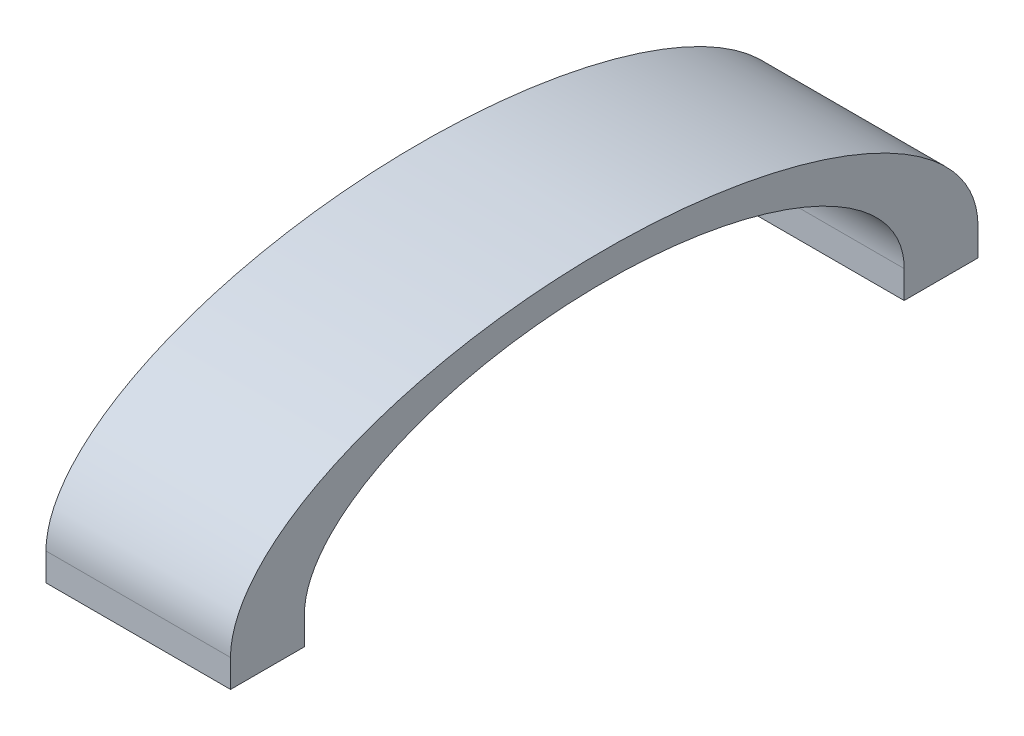
ISO-10303-21;
HEADER;
FILE_DESCRIPTION(('STEP AP214'),'2;1');
FILE_NAME('part.step','',(''),(''),'','','');
FILE_SCHEMA(('AUTOMOTIVE_DESIGN { 1 0 10303 214 1 1 1 1 }'));
ENDSEC;
DATA;
#1=APPLICATION_CONTEXT('core data for automotive mechanical design processes');
#2=APPLICATION_PROTOCOL_DEFINITION('international standard','automotive_design',2000,#1);
#3=PRODUCT_CONTEXT('',#1,'mechanical');
#4=PRODUCT('Part','Part','',(#3));
#5=PRODUCT_RELATED_PRODUCT_CATEGORY('part','',(#4));
#6=PRODUCT_DEFINITION_FORMATION('','',#4);
#7=PRODUCT_DEFINITION_CONTEXT('part definition',#1,'design');
#8=PRODUCT_DEFINITION('design','',#6,#7);
#9=PRODUCT_DEFINITION_SHAPE('','',#8);
#10=(LENGTH_UNIT() NAMED_UNIT(*) SI_UNIT(.MILLI.,.METRE.));
#11=(NAMED_UNIT(*) PLANE_ANGLE_UNIT() SI_UNIT($,.RADIAN.));
#12=(NAMED_UNIT(*) SI_UNIT($,.STERADIAN.) SOLID_ANGLE_UNIT());
#13=UNCERTAINTY_MEASURE_WITH_UNIT(LENGTH_MEASURE(1.E-05),#10,'distance_accuracy_value','');
#14=(GEOMETRIC_REPRESENTATION_CONTEXT(3) GLOBAL_UNCERTAINTY_ASSIGNED_CONTEXT((#13)) GLOBAL_UNIT_ASSIGNED_CONTEXT((#10,
#11,#12)) REPRESENTATION_CONTEXT('',''));
#15=CARTESIAN_POINT('',(0.,0.,0.));
#16=DIRECTION('',(0.,0.,1.));
#17=DIRECTION('',(1.,0.,0.));
#18=AXIS2_PLACEMENT_3D('',#15,#16,#17);
#19=CARTESIAN_POINT('',(10.,0.,0.));
#20=DIRECTION('',(1.,0.,0.));
#21=DIRECTION('',(0.,0.,-1.));
#22=AXIS2_PLACEMENT_3D('',#19,#20,#21);
#23=ELLIPSE('',#22,40.5,18.);
#24=DIRECTION('',(-1.,0.,0.));
#25=VECTOR('',#24,1.);
#26=SURFACE_OF_LINEAR_EXTRUSION('',#23,#25);
#27=CARTESIAN_POINT('',(-10.,0.,0.));
#28=DIRECTION('',(1.,0.,0.));
#29=DIRECTION('',(0.,0.,-1.));
#30=AXIS2_PLACEMENT_3D('',#27,#28,#29);
#31=ELLIPSE('',#30,40.5,18.);
#32=CARTESIAN_POINT('',(-10.,0.,-40.5));
#33=VERTEX_POINT('',#32);
#34=CARTESIAN_POINT('',(-10.,0.,40.5));
#35=VERTEX_POINT('',#34);
#36=EDGE_CURVE('E192',#33,#35,#31,.T.);
#37=ORIENTED_EDGE('',*,*,#36,.T.);
#38=DIRECTION('',(-1.,0.,0.));
#39=VECTOR('',#38,1.);
#40=CARTESIAN_POINT('',(10.,0.,40.5));
#41=LINE('',#40,#39);
#42=CARTESIAN_POINT('',(10.,0.,40.5));
#43=VERTEX_POINT('',#42);
#44=EDGE_CURVE('E153',#43,#35,#41,.T.);
#45=ORIENTED_EDGE('',*,*,#44,.F.);
#46=CARTESIAN_POINT('',(10.,0.,-40.5));
#47=VERTEX_POINT('',#46);
#48=EDGE_CURVE('E62',#47,#43,#23,.T.);
#49=ORIENTED_EDGE('',*,*,#48,.F.);
#50=DIRECTION('',(-1.,0.,0.));
#51=VECTOR('',#50,1.);
#52=CARTESIAN_POINT('',(10.,0.,-40.5));
#53=LINE('',#52,#51);
#54=EDGE_CURVE('E55',#47,#33,#53,.T.);
#55=ORIENTED_EDGE('',*,*,#54,.T.);
#56=EDGE_LOOP('',(#37,#45,#49,#55));
#57=FACE_BOUND('',#56,.T.);
#58=ADVANCED_FACE('F45',(#57),#26,.F.);
#59=CARTESIAN_POINT('',(10.,0.,0.));
#60=DIRECTION('',(-1.,0.,0.));
#61=DIRECTION('',(0.,0.,1.));
#62=AXIS2_PLACEMENT_3D('',#59,#60,#61);
#63=ELLIPSE('',#62,32.5,15.);
#64=DIRECTION('',(-1.,0.,0.));
#65=VECTOR('',#64,1.);
#66=SURFACE_OF_LINEAR_EXTRUSION('',#63,#65);
#67=CARTESIAN_POINT('',(-10.,0.,0.));
#68=DIRECTION('',(-1.,0.,0.));
#69=DIRECTION('',(0.,0.,1.));
#70=AXIS2_PLACEMENT_3D('',#67,#68,#69);
#71=ELLIPSE('',#70,32.5,15.);
#72=CARTESIAN_POINT('',(-10.,0.,32.5));
#73=VERTEX_POINT('',#72);
#74=CARTESIAN_POINT('',(-10.,0.,-32.5));
#75=VERTEX_POINT('',#74);
#76=EDGE_CURVE('E197',#73,#75,#71,.T.);
#77=ORIENTED_EDGE('',*,*,#76,.T.);
#78=DIRECTION('',(-1.,0.,0.));
#79=VECTOR('',#78,1.);
#80=CARTESIAN_POINT('',(10.,0.,-32.5));
#81=LINE('',#80,#79);
#82=CARTESIAN_POINT('',(10.,0.,-32.5));
#83=VERTEX_POINT('',#82);
#84=EDGE_CURVE('E11',#83,#75,#81,.T.);
#85=ORIENTED_EDGE('',*,*,#84,.F.);
#86=CARTESIAN_POINT('',(10.,0.,32.5));
#87=VERTEX_POINT('',#86);
#88=EDGE_CURVE('E196',#87,#83,#63,.T.);
#89=ORIENTED_EDGE('',*,*,#88,.F.);
#90=DIRECTION('',(-1.,0.,0.));
#91=VECTOR('',#90,1.);
#92=CARTESIAN_POINT('',(10.,0.,32.5));
#93=LINE('',#92,#91);
#94=EDGE_CURVE('E114',#87,#73,#93,.T.);
#95=ORIENTED_EDGE('',*,*,#94,.T.);
#96=EDGE_LOOP('',(#77,#85,#89,#95));
#97=FACE_BOUND('',#96,.T.);
#98=ADVANCED_FACE('F202',(#97),#66,.F.);
#99=CARTESIAN_POINT('',(10.,0.,0.));
#100=DIRECTION('',(-1.,0.,0.));
#101=DIRECTION('',(0.,0.,1.));
#102=AXIS2_PLACEMENT_3D('',#99,#100,#101);
#103=PLANE('',#102);
#104=ORIENTED_EDGE('',*,*,#48,.T.);
#105=DIRECTION('',(0.,1.,0.));
#106=VECTOR('',#105,1.);
#107=CARTESIAN_POINT('',(10.,-3.00000000000001,40.5));
#108=LINE('',#107,#106);
#109=CARTESIAN_POINT('',(10.,-3.00000000000001,40.5));
#110=VERTEX_POINT('',#109);
#111=EDGE_CURVE('E119',#110,#43,#108,.T.);
#112=ORIENTED_EDGE('',*,*,#111,.F.);
#113=DIRECTION('',(0.,0.,-1.));
#114=VECTOR('',#113,1.);
#115=CARTESIAN_POINT('',(10.,-3.00000000000001,40.5));
#116=LINE('',#115,#114);
#117=CARTESIAN_POINT('',(10.,-3.,32.5));
#118=VERTEX_POINT('',#117);
#119=EDGE_CURVE('E125',#110,#118,#116,.T.);
#120=ORIENTED_EDGE('',*,*,#119,.T.);
#121=DIRECTION('',(0.,1.,0.));
#122=VECTOR('',#121,1.);
#123=CARTESIAN_POINT('',(10.,-3.,32.5));
#124=LINE('',#123,#122);
#125=EDGE_CURVE('E108',#118,#87,#124,.T.);
#126=ORIENTED_EDGE('',*,*,#125,.T.);
#127=ORIENTED_EDGE('',*,*,#88,.T.);
#128=DIRECTION('',(0.,1.,0.));
#129=VECTOR('',#128,1.);
#130=CARTESIAN_POINT('',(10.,-3.,-32.5));
#131=LINE('',#130,#129);
#132=CARTESIAN_POINT('',(10.,-3.,-32.5));
#133=VERTEX_POINT('',#132);
#134=EDGE_CURVE('E177',#133,#83,#131,.T.);
#135=ORIENTED_EDGE('',*,*,#134,.F.);
#136=DIRECTION('',(0.,0.,1.));
#137=VECTOR('',#136,1.);
#138=CARTESIAN_POINT('',(10.,-3.00000000000001,-40.5));
#139=LINE('',#138,#137);
#140=CARTESIAN_POINT('',(10.,-3.00000000000001,-40.5));
#141=VERTEX_POINT('',#140);
#142=EDGE_CURVE('E174',#141,#133,#139,.T.);
#143=ORIENTED_EDGE('',*,*,#142,.F.);
#144=DIRECTION('',(0.,1.,0.));
#145=VECTOR('',#144,1.);
#146=CARTESIAN_POINT('',(10.,-3.00000000000001,-40.5));
#147=LINE('',#146,#145);
#148=EDGE_CURVE('E181',#141,#47,#147,.T.);
#149=ORIENTED_EDGE('',*,*,#148,.T.);
#150=EDGE_LOOP('',(#104,#112,#120,#126,#127,#135,#143,#149));
#151=FACE_BOUND('',#150,.T.);
#152=ADVANCED_FACE('F132',(#151),#103,.F.);
#153=CARTESIAN_POINT('',(-10.,0.,0.));
#154=DIRECTION('',(-1.,0.,0.));
#155=DIRECTION('',(0.,0.,1.));
#156=AXIS2_PLACEMENT_3D('',#153,#154,#155);
#157=PLANE('',#156);
#158=ORIENTED_EDGE('',*,*,#36,.F.);
#159=DIRECTION('',(0.,1.,0.));
#160=VECTOR('',#159,1.);
#161=CARTESIAN_POINT('',(-10.,-3.00000000000001,-40.5));
#162=LINE('',#161,#160);
#163=CARTESIAN_POINT('',(-10.,-3.00000000000001,-40.5));
#164=VERTEX_POINT('',#163);
#165=EDGE_CURVE('E185',#164,#33,#162,.T.);
#166=ORIENTED_EDGE('',*,*,#165,.F.);
#167=DIRECTION('',(0.,0.,-1.));
#168=VECTOR('',#167,1.);
#169=CARTESIAN_POINT('',(-10.,-3.,-32.5));
#170=LINE('',#169,#168);
#171=CARTESIAN_POINT('',(-10.,-3.,-32.5));
#172=VERTEX_POINT('',#171);
#173=EDGE_CURVE('E168',#172,#164,#170,.T.);
#174=ORIENTED_EDGE('',*,*,#173,.F.);
#175=DIRECTION('',(0.,1.,0.));
#176=VECTOR('',#175,1.);
#177=CARTESIAN_POINT('',(-10.,-3.,-32.5));
#178=LINE('',#177,#176);
#179=EDGE_CURVE('E189',#172,#75,#178,.T.);
#180=ORIENTED_EDGE('',*,*,#179,.T.);
#181=ORIENTED_EDGE('',*,*,#76,.F.);
#182=DIRECTION('',(0.,1.,0.));
#183=VECTOR('',#182,1.);
#184=CARTESIAN_POINT('',(-10.,-3.,32.5));
#185=LINE('',#184,#183);
#186=CARTESIAN_POINT('',(-10.,-3.,32.5));
#187=VERTEX_POINT('',#186);
#188=EDGE_CURVE('E142',#187,#73,#185,.T.);
#189=ORIENTED_EDGE('',*,*,#188,.F.);
#190=DIRECTION('',(0.,0.,1.));
#191=VECTOR('',#190,1.);
#192=CARTESIAN_POINT('',(-10.,-3.,32.5));
#193=LINE('',#192,#191);
#194=CARTESIAN_POINT('',(-10.,-3.00000000000001,40.5));
#195=VERTEX_POINT('',#194);
#196=EDGE_CURVE('E128',#187,#195,#193,.T.);
#197=ORIENTED_EDGE('',*,*,#196,.T.);
#198=DIRECTION('',(0.,1.,0.));
#199=VECTOR('',#198,1.);
#200=CARTESIAN_POINT('',(-10.,-3.00000000000001,40.5));
#201=LINE('',#200,#199);
#202=EDGE_CURVE('E145',#195,#35,#201,.T.);
#203=ORIENTED_EDGE('',*,*,#202,.T.);
#204=EDGE_LOOP('',(#158,#166,#174,#180,#181,#189,#197,#203));
#205=FACE_BOUND('',#204,.T.);
#206=ADVANCED_FACE('F206',(#205),#157,.T.);
#207=CARTESIAN_POINT('',(10.,-3.,-32.5));
#208=DIRECTION('',(0.,0.,-1.));
#209=DIRECTION('',(0.,1.,0.));
#210=AXIS2_PLACEMENT_3D('',#207,#208,#209);
#211=PLANE('',#210);
#212=ORIENTED_EDGE('',*,*,#84,.T.);
#213=ORIENTED_EDGE('',*,*,#179,.F.);
#214=DIRECTION('',(-1.,0.,0.));
#215=VECTOR('',#214,1.);
#216=CARTESIAN_POINT('',(10.,-3.,-32.5));
#217=LINE('',#216,#215);
#218=EDGE_CURVE('E161',#133,#172,#217,.T.);
#219=ORIENTED_EDGE('',*,*,#218,.F.);
#220=ORIENTED_EDGE('',*,*,#134,.T.);
#221=EDGE_LOOP('',(#212,#213,#219,#220));
#222=FACE_BOUND('',#221,.T.);
#223=ADVANCED_FACE('F209',(#222),#211,.F.);
#224=CARTESIAN_POINT('',(-10.,-3.00000000000001,-40.5));
#225=DIRECTION('',(0.,0.,1.));
#226=DIRECTION('',(0.,-1.,0.));
#227=AXIS2_PLACEMENT_3D('',#224,#225,#226);
#228=PLANE('',#227);
#229=ORIENTED_EDGE('',*,*,#54,.F.);
#230=ORIENTED_EDGE('',*,*,#148,.F.);
#231=DIRECTION('',(1.,0.,0.));
#232=VECTOR('',#231,1.);
#233=CARTESIAN_POINT('',(-10.,-3.00000000000001,-40.5));
#234=LINE('',#233,#232);
#235=EDGE_CURVE('E171',#164,#141,#234,.T.);
#236=ORIENTED_EDGE('',*,*,#235,.F.);
#237=ORIENTED_EDGE('',*,*,#165,.T.);
#238=EDGE_LOOP('',(#229,#230,#236,#237));
#239=FACE_BOUND('',#238,.T.);
#240=ADVANCED_FACE('F215',(#239),#228,.F.);
#241=CARTESIAN_POINT('',(0.,-3.,0.));
#242=DIRECTION('',(0.,-1.,0.));
#243=DIRECTION('',(0.,0.,-1.));
#244=AXIS2_PLACEMENT_3D('',#241,#242,#243);
#245=PLANE('',#244);
#246=CARTESIAN_POINT('',(0.,-3.,-36.5));
#247=DIRECTION('',(0.,-1.,0.));
#248=DIRECTION('',(0.,0.,-1.));
#249=AXIS2_PLACEMENT_3D('',#246,#247,#248);
#250=CIRCLE('',#249,2.1);
#251=CARTESIAN_POINT('',(0.,-3.00000000000001,-38.6));
#252=VERTEX_POINT('',#251);
#253=EDGE_CURVE('E156',#252,#252,#250,.T.);
#254=ORIENTED_EDGE('',*,*,#253,.F.);
#255=EDGE_LOOP('',(#254));
#256=FACE_BOUND('',#255,.T.);
#257=ORIENTED_EDGE('',*,*,#218,.T.);
#258=ORIENTED_EDGE('',*,*,#173,.T.);
#259=ORIENTED_EDGE('',*,*,#235,.T.);
#260=ORIENTED_EDGE('',*,*,#142,.T.);
#261=EDGE_LOOP('',(#257,#258,#259,#260));
#262=FACE_BOUND('',#261,.T.);
#263=ADVANCED_FACE('F219',(#256,#262),#245,.T.);
#264=CARTESIAN_POINT('',(0.,2.7,-36.5));
#265=DIRECTION('',(0.,-1.,0.));
#266=DIRECTION('',(0.,0.,-1.));
#267=AXIS2_PLACEMENT_3D('',#264,#265,#266);
#268=CYLINDRICAL_SURFACE('',#267,2.1);
#269=CARTESIAN_POINT('',(0.,2.7,-36.5));
#270=DIRECTION('',(0.,-1.,0.));
#271=DIRECTION('',(0.,0.,-1.));
#272=AXIS2_PLACEMENT_3D('',#269,#270,#271);
#273=CIRCLE('',#272,2.1);
#274=CARTESIAN_POINT('',(0.,2.69999999999999,-38.6));
#275=VERTEX_POINT('',#274);
#276=EDGE_CURVE('E157',#275,#275,#273,.T.);
#277=ORIENTED_EDGE('',*,*,#276,.F.);
#278=EDGE_LOOP('',(#277));
#279=FACE_BOUND('',#278,.T.);
#280=ORIENTED_EDGE('',*,*,#253,.T.);
#281=EDGE_LOOP('',(#280));
#282=FACE_BOUND('',#281,.T.);
#283=ADVANCED_FACE('F223',(#279,#282),#268,.F.);
#284=CARTESIAN_POINT('',(0.,2.7,-36.5));
#285=DIRECTION('',(0.,-1.,0.));
#286=DIRECTION('',(0.,0.,-1.));
#287=AXIS2_PLACEMENT_3D('',#284,#285,#286);
#288=PLANE('',#287);
#289=ORIENTED_EDGE('',*,*,#276,.T.);
#290=EDGE_LOOP('',(#289));
#291=FACE_BOUND('',#290,.T.);
#292=ADVANCED_FACE('F227',(#291),#288,.T.);
#293=CARTESIAN_POINT('',(10.,-3.,32.5));
#294=DIRECTION('',(0.,0.,-1.));
#295=DIRECTION('',(0.,1.,0.));
#296=AXIS2_PLACEMENT_3D('',#293,#294,#295);
#297=PLANE('',#296);
#298=ORIENTED_EDGE('',*,*,#94,.F.);
#299=ORIENTED_EDGE('',*,*,#125,.F.);
#300=DIRECTION('',(-1.,0.,0.));
#301=VECTOR('',#300,1.);
#302=CARTESIAN_POINT('',(10.,-3.,32.5));
#303=LINE('',#302,#301);
#304=EDGE_CURVE('E111',#118,#187,#303,.T.);
#305=ORIENTED_EDGE('',*,*,#304,.T.);
#306=ORIENTED_EDGE('',*,*,#188,.T.);
#307=EDGE_LOOP('',(#298,#299,#305,#306));
#308=FACE_BOUND('',#307,.T.);
#309=ADVANCED_FACE('F110',(#308),#297,.T.);
#310=CARTESIAN_POINT('',(-10.,-3.00000000000001,40.5));
#311=DIRECTION('',(0.,0.,1.));
#312=DIRECTION('',(0.,-1.,0.));
#313=AXIS2_PLACEMENT_3D('',#310,#311,#312);
#314=PLANE('',#313);
#315=ORIENTED_EDGE('',*,*,#44,.T.);
#316=ORIENTED_EDGE('',*,*,#202,.F.);
#317=DIRECTION('',(1.,0.,0.));
#318=VECTOR('',#317,1.);
#319=CARTESIAN_POINT('',(-10.,-3.00000000000001,40.5));
#320=LINE('',#319,#318);
#321=EDGE_CURVE('E134',#195,#110,#320,.T.);
#322=ORIENTED_EDGE('',*,*,#321,.T.);
#323=ORIENTED_EDGE('',*,*,#111,.T.);
#324=EDGE_LOOP('',(#315,#316,#322,#323));
#325=FACE_BOUND('',#324,.T.);
#326=ADVANCED_FACE('F234',(#325),#314,.T.);
#327=CARTESIAN_POINT('',(0.,-3.,0.));
#328=DIRECTION('',(0.,-1.,0.));
#329=DIRECTION('',(0.,0.,1.));
#330=AXIS2_PLACEMENT_3D('',#327,#328,#329);
#331=PLANE('',#330);
#332=CARTESIAN_POINT('',(0.,-3.,36.5));
#333=DIRECTION('',(0.,1.,0.));
#334=DIRECTION('',(0.,0.,1.));
#335=AXIS2_PLACEMENT_3D('',#332,#333,#334);
#336=CIRCLE('',#335,2.1);
#337=CARTESIAN_POINT('',(0.,-3.00000000000001,38.6));
#338=VERTEX_POINT('',#337);
#339=EDGE_CURVE('E375',#338,#338,#336,.T.);
#340=ORIENTED_EDGE('',*,*,#339,.T.);
#341=EDGE_LOOP('',(#340));
#342=FACE_BOUND('',#341,.T.);
#343=ORIENTED_EDGE('',*,*,#304,.F.);
#344=ORIENTED_EDGE('',*,*,#119,.F.);
#345=ORIENTED_EDGE('',*,*,#321,.F.);
#346=ORIENTED_EDGE('',*,*,#196,.F.);
#347=EDGE_LOOP('',(#343,#344,#345,#346));
#348=FACE_BOUND('',#347,.T.);
#349=ADVANCED_FACE('F123',(#342,#348),#331,.T.);
#350=CARTESIAN_POINT('',(0.,2.7,36.5));
#351=DIRECTION('',(0.,-1.,0.));
#352=DIRECTION('',(0.,0.,-1.));
#353=AXIS2_PLACEMENT_3D('',#350,#351,#352);
#354=CYLINDRICAL_SURFACE('',#353,2.1);
#355=CARTESIAN_POINT('',(0.,2.7,36.5));
#356=DIRECTION('',(0.,1.,0.));
#357=DIRECTION('',(0.,0.,1.));
#358=AXIS2_PLACEMENT_3D('',#355,#356,#357);
#359=CIRCLE('',#358,2.1);
#360=CARTESIAN_POINT('',(0.,2.69999999999999,38.6));
#361=VERTEX_POINT('',#360);
#362=EDGE_CURVE('E130',#361,#361,#359,.T.);
#363=ORIENTED_EDGE('',*,*,#362,.T.);
#364=EDGE_LOOP('',(#363));
#365=FACE_BOUND('',#364,.T.);
#366=ORIENTED_EDGE('',*,*,#339,.F.);
#367=EDGE_LOOP('',(#366));
#368=FACE_BOUND('',#367,.T.);
#369=ADVANCED_FACE('F240',(#365,#368),#354,.F.);
#370=CARTESIAN_POINT('',(0.,2.7,36.5));
#371=DIRECTION('',(0.,-1.,0.));
#372=DIRECTION('',(0.,0.,1.));
#373=AXIS2_PLACEMENT_3D('',#370,#371,#372);
#374=PLANE('',#373);
#375=ORIENTED_EDGE('',*,*,#362,.F.);
#376=EDGE_LOOP('',(#375));
#377=FACE_BOUND('',#376,.T.);
#378=ADVANCED_FACE('F244',(#377),#374,.T.);
#379=CLOSED_SHELL('',(#58,#98,#152,#206,#223,#240,#263,#283,#292,#309,#326,#349,#369,#378));
#380=MANIFOLD_SOLID_BREP('B2',#379);
#381=ADVANCED_BREP_SHAPE_REPRESENTATION('',(#18,#380),#14);
#382=SHAPE_DEFINITION_REPRESENTATION(#9,#381);
ENDSEC;
END-ISO-10303-21;
